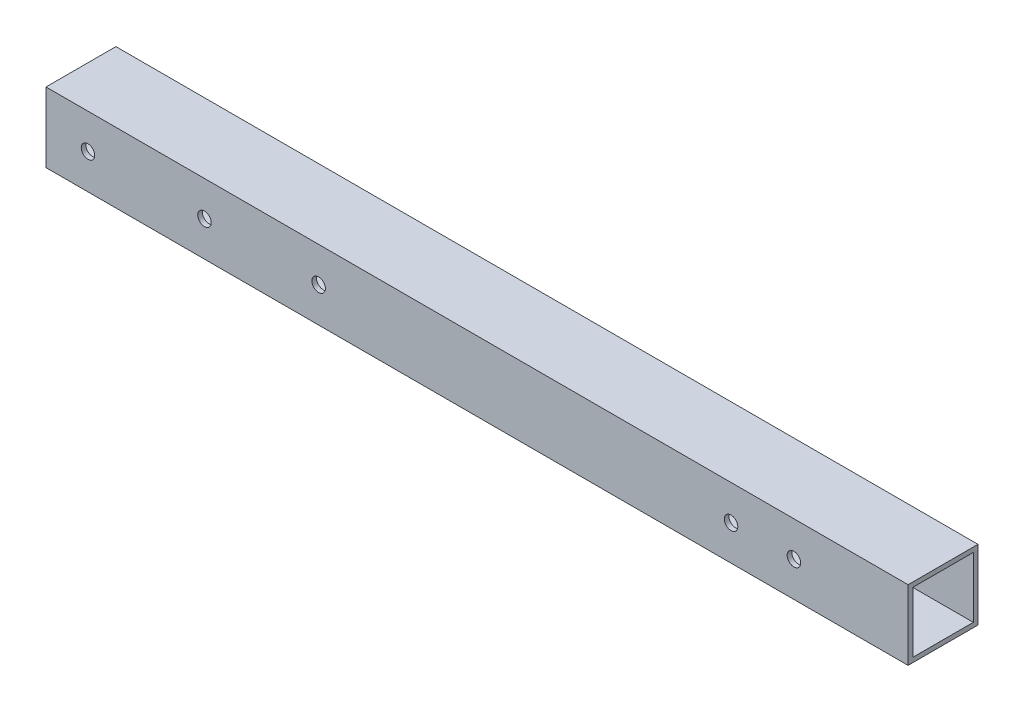
ISO-10303-21;
HEADER;
FILE_DESCRIPTION(('STEP AP214'),'2;1');
FILE_NAME('part.step','',(''),(''),'','','');
FILE_SCHEMA(('AUTOMOTIVE_DESIGN { 1 0 10303 214 1 1 1 1 }'));
ENDSEC;
DATA;
#1=APPLICATION_CONTEXT('core data for automotive mechanical design processes');
#2=APPLICATION_PROTOCOL_DEFINITION('international standard','automotive_design',2000,#1);
#3=PRODUCT_CONTEXT('',#1,'mechanical');
#4=PRODUCT('Part','Part','',(#3));
#5=PRODUCT_RELATED_PRODUCT_CATEGORY('part','',(#4));
#6=PRODUCT_DEFINITION_FORMATION('','',#4);
#7=PRODUCT_DEFINITION_CONTEXT('part definition',#1,'design');
#8=PRODUCT_DEFINITION('design','',#6,#7);
#9=PRODUCT_DEFINITION_SHAPE('','',#8);
#10=(LENGTH_UNIT() NAMED_UNIT(*) SI_UNIT(.MILLI.,.METRE.));
#11=(NAMED_UNIT(*) PLANE_ANGLE_UNIT() SI_UNIT($,.RADIAN.));
#12=(NAMED_UNIT(*) SI_UNIT($,.STERADIAN.) SOLID_ANGLE_UNIT());
#13=UNCERTAINTY_MEASURE_WITH_UNIT(LENGTH_MEASURE(1.E-05),#10,'distance_accuracy_value','');
#14=(GEOMETRIC_REPRESENTATION_CONTEXT(3) GLOBAL_UNCERTAINTY_ASSIGNED_CONTEXT((#13)) GLOBAL_UNIT_ASSIGNED_CONTEXT((#10,
#11,#12)) REPRESENTATION_CONTEXT('',''));
#15=CARTESIAN_POINT('',(0.,0.,0.));
#16=DIRECTION('',(0.,0.,1.));
#17=DIRECTION('',(1.,0.,0.));
#18=AXIS2_PLACEMENT_3D('',#15,#16,#17);
#19=CARTESIAN_POINT('',(185.,0.,0.));
#20=DIRECTION('',(-1.,0.,0.));
#21=DIRECTION('',(0.,0.,1.));
#22=AXIS2_PLACEMENT_3D('',#19,#20,#21);
#23=PLANE('',#22);
#24=DIRECTION('',(0.,1.,0.));
#25=VECTOR('',#24,1.);
#26=CARTESIAN_POINT('',(185.,-7.5,-7.5));
#27=LINE('',#26,#25);
#28=CARTESIAN_POINT('',(185.,-7.5,-7.5));
#29=VERTEX_POINT('',#28);
#30=CARTESIAN_POINT('',(185.,7.5,-7.5));
#31=VERTEX_POINT('',#30);
#32=EDGE_CURVE('E146',#29,#31,#27,.T.);
#33=ORIENTED_EDGE('',*,*,#32,.T.);
#34=DIRECTION('',(0.,0.,1.));
#35=VECTOR('',#34,1.);
#36=CARTESIAN_POINT('',(185.,7.5,7.5));
#37=LINE('',#36,#35);
#38=CARTESIAN_POINT('',(185.,7.5,7.5));
#39=VERTEX_POINT('',#38);
#40=EDGE_CURVE('E149',#31,#39,#37,.T.);
#41=ORIENTED_EDGE('',*,*,#40,.T.);
#42=DIRECTION('',(0.,-1.,0.));
#43=VECTOR('',#42,1.);
#44=CARTESIAN_POINT('',(185.,-7.5,7.5));
#45=LINE('',#44,#43);
#46=CARTESIAN_POINT('',(185.,-7.5,7.5));
#47=VERTEX_POINT('',#46);
#48=EDGE_CURVE('E152',#39,#47,#45,.T.);
#49=ORIENTED_EDGE('',*,*,#48,.T.);
#50=DIRECTION('',(0.,0.,-1.));
#51=VECTOR('',#50,1.);
#52=CARTESIAN_POINT('',(185.,-7.5,7.5));
#53=LINE('',#52,#51);
#54=EDGE_CURVE('E154',#47,#29,#53,.T.);
#55=ORIENTED_EDGE('',*,*,#54,.T.);
#56=EDGE_LOOP('',(#33,#41,#49,#55));
#57=FACE_BOUND('',#56,.T.);
#58=DIRECTION('',(0.,0.,-1.));
#59=VECTOR('',#58,1.);
#60=CARTESIAN_POINT('',(185.,-6.5,6.5));
#61=LINE('',#60,#59);
#62=CARTESIAN_POINT('',(185.,-6.5,6.5));
#63=VERTEX_POINT('',#62);
#64=CARTESIAN_POINT('',(185.,-6.5,-6.5));
#65=VERTEX_POINT('',#64);
#66=EDGE_CURVE('E108',#63,#65,#61,.T.);
#67=ORIENTED_EDGE('',*,*,#66,.F.);
#68=DIRECTION('',(0.,-1.,0.));
#69=VECTOR('',#68,1.);
#70=CARTESIAN_POINT('',(185.,-6.5,6.5));
#71=LINE('',#70,#69);
#72=CARTESIAN_POINT('',(185.,6.5,6.5));
#73=VERTEX_POINT('',#72);
#74=EDGE_CURVE('E130',#73,#63,#71,.T.);
#75=ORIENTED_EDGE('',*,*,#74,.F.);
#76=DIRECTION('',(0.,0.,1.));
#77=VECTOR('',#76,1.);
#78=CARTESIAN_POINT('',(185.,6.5,6.5));
#79=LINE('',#78,#77);
#80=CARTESIAN_POINT('',(185.,6.5,-6.5));
#81=VERTEX_POINT('',#80);
#82=EDGE_CURVE('E128',#81,#73,#79,.T.);
#83=ORIENTED_EDGE('',*,*,#82,.F.);
#84=DIRECTION('',(0.,1.,0.));
#85=VECTOR('',#84,1.);
#86=CARTESIAN_POINT('',(185.,-6.5,-6.5));
#87=LINE('',#86,#85);
#88=EDGE_CURVE('E116',#65,#81,#87,.T.);
#89=ORIENTED_EDGE('',*,*,#88,.F.);
#90=EDGE_LOOP('',(#67,#75,#83,#89));
#91=FACE_BOUND('',#90,.T.);
#92=ADVANCED_FACE('F41',(#57,#91),#23,.F.);
#93=CARTESIAN_POINT('',(0.,0.,0.));
#94=DIRECTION('',(-1.,0.,0.));
#95=DIRECTION('',(0.,0.,1.));
#96=AXIS2_PLACEMENT_3D('',#93,#94,#95);
#97=PLANE('',#96);
#98=DIRECTION('',(0.,1.,0.));
#99=VECTOR('',#98,1.);
#100=CARTESIAN_POINT('',(0.,-7.5,-7.5));
#101=LINE('',#100,#99);
#102=CARTESIAN_POINT('',(0.,-7.5,-7.5));
#103=VERTEX_POINT('',#102);
#104=CARTESIAN_POINT('',(0.,7.5,-7.5));
#105=VERTEX_POINT('',#104);
#106=EDGE_CURVE('E124',#103,#105,#101,.T.);
#107=ORIENTED_EDGE('',*,*,#106,.F.);
#108=DIRECTION('',(0.,0.,-1.));
#109=VECTOR('',#108,1.);
#110=CARTESIAN_POINT('',(0.,-7.5,7.5));
#111=LINE('',#110,#109);
#112=CARTESIAN_POINT('',(0.,-7.5,7.5));
#113=VERTEX_POINT('',#112);
#114=EDGE_CURVE('E150',#113,#103,#111,.T.);
#115=ORIENTED_EDGE('',*,*,#114,.F.);
#116=DIRECTION('',(0.,-1.,0.));
#117=VECTOR('',#116,1.);
#118=CARTESIAN_POINT('',(0.,-7.5,7.5));
#119=LINE('',#118,#117);
#120=CARTESIAN_POINT('',(0.,7.5,7.5));
#121=VERTEX_POINT('',#120);
#122=EDGE_CURVE('E161',#121,#113,#119,.T.);
#123=ORIENTED_EDGE('',*,*,#122,.F.);
#124=DIRECTION('',(0.,0.,1.));
#125=VECTOR('',#124,1.);
#126=CARTESIAN_POINT('',(0.,7.5,7.5));
#127=LINE('',#126,#125);
#128=EDGE_CURVE('E159',#105,#121,#127,.T.);
#129=ORIENTED_EDGE('',*,*,#128,.F.);
#130=EDGE_LOOP('',(#107,#115,#123,#129));
#131=FACE_BOUND('',#130,.T.);
#132=DIRECTION('',(0.,-1.,0.));
#133=VECTOR('',#132,1.);
#134=CARTESIAN_POINT('',(0.,-6.5,6.5));
#135=LINE('',#134,#133);
#136=CARTESIAN_POINT('',(0.,6.5,6.5));
#137=VERTEX_POINT('',#136);
#138=CARTESIAN_POINT('',(0.,-6.5,6.5));
#139=VERTEX_POINT('',#138);
#140=EDGE_CURVE('E117',#137,#139,#135,.T.);
#141=ORIENTED_EDGE('',*,*,#140,.T.);
#142=DIRECTION('',(0.,0.,-1.));
#143=VECTOR('',#142,1.);
#144=CARTESIAN_POINT('',(0.,-6.5,6.5));
#145=LINE('',#144,#143);
#146=CARTESIAN_POINT('',(0.,-6.5,-6.5));
#147=VERTEX_POINT('',#146);
#148=EDGE_CURVE('E66',#139,#147,#145,.T.);
#149=ORIENTED_EDGE('',*,*,#148,.T.);
#150=DIRECTION('',(0.,1.,0.));
#151=VECTOR('',#150,1.);
#152=CARTESIAN_POINT('',(0.,-6.5,-6.5));
#153=LINE('',#152,#151);
#154=CARTESIAN_POINT('',(0.,6.5,-6.5));
#155=VERTEX_POINT('',#154);
#156=EDGE_CURVE('E123',#147,#155,#153,.T.);
#157=ORIENTED_EDGE('',*,*,#156,.T.);
#158=DIRECTION('',(0.,0.,1.));
#159=VECTOR('',#158,1.);
#160=CARTESIAN_POINT('',(0.,6.5,6.5));
#161=LINE('',#160,#159);
#162=EDGE_CURVE('E138',#155,#137,#161,.T.);
#163=ORIENTED_EDGE('',*,*,#162,.T.);
#164=EDGE_LOOP('',(#141,#149,#157,#163));
#165=FACE_BOUND('',#164,.T.);
#166=ADVANCED_FACE('F219',(#131,#165),#97,.T.);
#167=CARTESIAN_POINT('',(185.,-7.5,-7.5));
#168=DIRECTION('',(0.,0.,1.));
#169=DIRECTION('',(1.,0.,0.));
#170=AXIS2_PLACEMENT_3D('',#167,#168,#169);
#171=PLANE('',#170);
#172=CARTESIAN_POINT('',(9.01039609334854,0.,-7.5));
#173=DIRECTION('',(0.,0.,-1.));
#174=DIRECTION('',(-1.,0.,0.));
#175=AXIS2_PLACEMENT_3D('',#172,#173,#174);
#176=CIRCLE('',#175,1.45);
#177=CARTESIAN_POINT('',(7.56039609334854,0.,-7.5));
#178=VERTEX_POINT('',#177);
#179=EDGE_CURVE('E270',#178,#178,#176,.T.);
#180=ORIENTED_EDGE('',*,*,#179,.F.);
#181=EDGE_LOOP('',(#180));
#182=FACE_BOUND('',#181,.T.);
#183=CARTESIAN_POINT('',(160.5,-1.05818132034585E-13,-7.5));
#184=DIRECTION('',(0.,0.,-1.));
#185=DIRECTION('',(-1.,0.,0.));
#186=AXIS2_PLACEMENT_3D('',#183,#184,#185);
#187=CIRCLE('',#186,1.45);
#188=CARTESIAN_POINT('',(159.05,-1.05818132034585E-13,-7.5));
#189=VERTEX_POINT('',#188);
#190=EDGE_CURVE('E274',#189,#189,#187,.T.);
#191=ORIENTED_EDGE('',*,*,#190,.F.);
#192=EDGE_LOOP('',(#191));
#193=FACE_BOUND('',#192,.T.);
#194=CARTESIAN_POINT('',(147.,-1.04950770296597E-13,-7.5));
#195=DIRECTION('',(0.,0.,-1.));
#196=DIRECTION('',(-1.,0.,0.));
#197=AXIS2_PLACEMENT_3D('',#194,#195,#196);
#198=CIRCLE('',#197,1.45);
#199=CARTESIAN_POINT('',(145.55,-1.04950770296597E-13,-7.5));
#200=VERTEX_POINT('',#199);
#201=EDGE_CURVE('E278',#200,#200,#198,.T.);
#202=ORIENTED_EDGE('',*,*,#201,.F.);
#203=EDGE_LOOP('',(#202));
#204=FACE_BOUND('',#203,.T.);
#205=CARTESIAN_POINT('',(58.5000000000001,0.,-7.5));
#206=DIRECTION('',(0.,0.,-1.));
#207=DIRECTION('',(-1.,0.,0.));
#208=AXIS2_PLACEMENT_3D('',#205,#206,#207);
#209=CIRCLE('',#208,1.45000000000001);
#210=CARTESIAN_POINT('',(57.0500000000001,0.,-7.5));
#211=VERTEX_POINT('',#210);
#212=EDGE_CURVE('E282',#211,#211,#209,.T.);
#213=ORIENTED_EDGE('',*,*,#212,.F.);
#214=EDGE_LOOP('',(#213));
#215=FACE_BOUND('',#214,.T.);
#216=CARTESIAN_POINT('',(34.0103960933485,0.,-7.5));
#217=DIRECTION('',(0.,0.,-1.));
#218=DIRECTION('',(-1.,0.,0.));
#219=AXIS2_PLACEMENT_3D('',#216,#217,#218);
#220=CIRCLE('',#219,1.45);
#221=CARTESIAN_POINT('',(32.5603960933486,0.,-7.5));
#222=VERTEX_POINT('',#221);
#223=EDGE_CURVE('E285',#222,#222,#220,.T.);
#224=ORIENTED_EDGE('',*,*,#223,.F.);
#225=EDGE_LOOP('',(#224));
#226=FACE_BOUND('',#225,.T.);
#227=ORIENTED_EDGE('',*,*,#106,.T.);
#228=DIRECTION('',(-1.,0.,0.));
#229=VECTOR('',#228,1.);
#230=CARTESIAN_POINT('',(185.,7.5,-7.5));
#231=LINE('',#230,#229);
#232=EDGE_CURVE('E11',#31,#105,#231,.T.);
#233=ORIENTED_EDGE('',*,*,#232,.F.);
#234=ORIENTED_EDGE('',*,*,#32,.F.);
#235=DIRECTION('',(-1.,0.,0.));
#236=VECTOR('',#235,1.);
#237=CARTESIAN_POINT('',(185.,-7.5,-7.5));
#238=LINE('',#237,#236);
#239=EDGE_CURVE('E156',#29,#103,#238,.T.);
#240=ORIENTED_EDGE('',*,*,#239,.T.);
#241=EDGE_LOOP('',(#227,#233,#234,#240));
#242=FACE_BOUND('',#241,.T.);
#243=ADVANCED_FACE('F43',(#182,#193,#204,#215,#226,#242),#171,.F.);
#244=CARTESIAN_POINT('',(185.,7.5,7.5));
#245=DIRECTION('',(0.,-1.,0.));
#246=DIRECTION('',(0.,0.,-1.));
#247=AXIS2_PLACEMENT_3D('',#244,#245,#246);
#248=PLANE('',#247);
#249=ORIENTED_EDGE('',*,*,#128,.T.);
#250=DIRECTION('',(-1.,0.,0.));
#251=VECTOR('',#250,1.);
#252=CARTESIAN_POINT('',(185.,7.5,7.5));
#253=LINE('',#252,#251);
#254=EDGE_CURVE('E50',#39,#121,#253,.T.);
#255=ORIENTED_EDGE('',*,*,#254,.F.);
#256=ORIENTED_EDGE('',*,*,#40,.F.);
#257=ORIENTED_EDGE('',*,*,#232,.T.);
#258=EDGE_LOOP('',(#249,#255,#256,#257));
#259=FACE_BOUND('',#258,.T.);
#260=ADVANCED_FACE('F246',(#259),#248,.F.);
#261=CARTESIAN_POINT('',(185.,-7.5,7.5));
#262=DIRECTION('',(0.,0.,-1.));
#263=DIRECTION('',(-1.,0.,0.));
#264=AXIS2_PLACEMENT_3D('',#261,#262,#263);
#265=PLANE('',#264);
#266=CARTESIAN_POINT('',(9.01039609334854,0.,7.5));
#267=DIRECTION('',(0.,0.,-1.));
#268=DIRECTION('',(-1.,0.,0.));
#269=AXIS2_PLACEMENT_3D('',#266,#267,#268);
#270=CIRCLE('',#269,1.45);
#271=CARTESIAN_POINT('',(7.56039609334854,0.,7.5));
#272=VERTEX_POINT('',#271);
#273=EDGE_CURVE('E175',#272,#272,#270,.T.);
#274=ORIENTED_EDGE('',*,*,#273,.T.);
#275=EDGE_LOOP('',(#274));
#276=FACE_BOUND('',#275,.T.);
#277=CARTESIAN_POINT('',(160.5,-1.05818132034585E-13,7.5));
#278=DIRECTION('',(0.,0.,-1.));
#279=DIRECTION('',(-1.,0.,0.));
#280=AXIS2_PLACEMENT_3D('',#277,#278,#279);
#281=CIRCLE('',#280,1.45);
#282=CARTESIAN_POINT('',(159.05,-1.05818132034585E-13,7.5));
#283=VERTEX_POINT('',#282);
#284=EDGE_CURVE('E344',#283,#283,#281,.T.);
#285=ORIENTED_EDGE('',*,*,#284,.T.);
#286=EDGE_LOOP('',(#285));
#287=FACE_BOUND('',#286,.T.);
#288=CARTESIAN_POINT('',(147.,-1.04950770296597E-13,7.5));
#289=DIRECTION('',(0.,0.,-1.));
#290=DIRECTION('',(-1.,0.,0.));
#291=AXIS2_PLACEMENT_3D('',#288,#289,#290);
#292=CIRCLE('',#291,1.45);
#293=CARTESIAN_POINT('',(145.55,-1.04950770296597E-13,7.5));
#294=VERTEX_POINT('',#293);
#295=EDGE_CURVE('E352',#294,#294,#292,.T.);
#296=ORIENTED_EDGE('',*,*,#295,.T.);
#297=EDGE_LOOP('',(#296));
#298=FACE_BOUND('',#297,.T.);
#299=CARTESIAN_POINT('',(58.5000000000001,0.,7.5));
#300=DIRECTION('',(0.,0.,-1.));
#301=DIRECTION('',(-1.,0.,0.));
#302=AXIS2_PLACEMENT_3D('',#299,#300,#301);
#303=CIRCLE('',#302,1.45000000000001);
#304=CARTESIAN_POINT('',(57.0500000000001,0.,7.5));
#305=VERTEX_POINT('',#304);
#306=EDGE_CURVE('E287',#305,#305,#303,.T.);
#307=ORIENTED_EDGE('',*,*,#306,.T.);
#308=EDGE_LOOP('',(#307));
#309=FACE_BOUND('',#308,.T.);
#310=CARTESIAN_POINT('',(34.0103960933485,0.,7.5));
#311=DIRECTION('',(0.,0.,-1.));
#312=DIRECTION('',(-1.,0.,0.));
#313=AXIS2_PLACEMENT_3D('',#310,#311,#312);
#314=CIRCLE('',#313,1.45);
#315=CARTESIAN_POINT('',(32.5603960933486,0.,7.5));
#316=VERTEX_POINT('',#315);
#317=EDGE_CURVE('E288',#316,#316,#314,.T.);
#318=ORIENTED_EDGE('',*,*,#317,.T.);
#319=EDGE_LOOP('',(#318));
#320=FACE_BOUND('',#319,.T.);
#321=ORIENTED_EDGE('',*,*,#122,.T.);
#322=DIRECTION('',(-1.,0.,0.));
#323=VECTOR('',#322,1.);
#324=CARTESIAN_POINT('',(185.,-7.5,7.5));
#325=LINE('',#324,#323);
#326=EDGE_CURVE('E166',#47,#113,#325,.T.);
#327=ORIENTED_EDGE('',*,*,#326,.F.);
#328=ORIENTED_EDGE('',*,*,#48,.F.);
#329=ORIENTED_EDGE('',*,*,#254,.T.);
#330=EDGE_LOOP('',(#321,#327,#328,#329));
#331=FACE_BOUND('',#330,.T.);
#332=ADVANCED_FACE('F243',(#276,#287,#298,#309,#320,#331),#265,.F.);
#333=CARTESIAN_POINT('',(185.,-7.5,7.5));
#334=DIRECTION('',(0.,1.,0.));
#335=DIRECTION('',(0.,0.,1.));
#336=AXIS2_PLACEMENT_3D('',#333,#334,#335);
#337=PLANE('',#336);
#338=ORIENTED_EDGE('',*,*,#114,.T.);
#339=ORIENTED_EDGE('',*,*,#239,.F.);
#340=ORIENTED_EDGE('',*,*,#54,.F.);
#341=ORIENTED_EDGE('',*,*,#326,.T.);
#342=EDGE_LOOP('',(#338,#339,#340,#341));
#343=FACE_BOUND('',#342,.T.);
#344=ADVANCED_FACE('F240',(#343),#337,.F.);
#345=CARTESIAN_POINT('',(185.,-6.5,6.5));
#346=DIRECTION('',(0.,1.,0.));
#347=DIRECTION('',(0.,0.,1.));
#348=AXIS2_PLACEMENT_3D('',#345,#346,#347);
#349=PLANE('',#348);
#350=ORIENTED_EDGE('',*,*,#148,.F.);
#351=DIRECTION('',(-1.,0.,0.));
#352=VECTOR('',#351,1.);
#353=CARTESIAN_POINT('',(185.,-6.5,6.5));
#354=LINE('',#353,#352);
#355=EDGE_CURVE('E112',#63,#139,#354,.T.);
#356=ORIENTED_EDGE('',*,*,#355,.F.);
#357=ORIENTED_EDGE('',*,*,#66,.T.);
#358=DIRECTION('',(-1.,0.,0.));
#359=VECTOR('',#358,1.);
#360=CARTESIAN_POINT('',(185.,-6.5,-6.5));
#361=LINE('',#360,#359);
#362=EDGE_CURVE('E111',#65,#147,#361,.T.);
#363=ORIENTED_EDGE('',*,*,#362,.T.);
#364=EDGE_LOOP('',(#350,#356,#357,#363));
#365=FACE_BOUND('',#364,.T.);
#366=ADVANCED_FACE('F110',(#365),#349,.T.);
#367=CARTESIAN_POINT('',(185.,-6.5,-6.5));
#368=DIRECTION('',(0.,0.,1.));
#369=DIRECTION('',(0.,-1.,0.));
#370=AXIS2_PLACEMENT_3D('',#367,#368,#369);
#371=PLANE('',#370);
#372=CARTESIAN_POINT('',(9.01039609334854,0.,-6.5));
#373=DIRECTION('',(0.,0.,1.));
#374=DIRECTION('',(0.,-1.,0.));
#375=AXIS2_PLACEMENT_3D('',#372,#373,#374);
#376=CIRCLE('',#375,1.45);
#377=CARTESIAN_POINT('',(9.01039609334854,-1.45,-6.5));
#378=VERTEX_POINT('',#377);
#379=EDGE_CURVE('E136',#378,#378,#376,.T.);
#380=ORIENTED_EDGE('',*,*,#379,.F.);
#381=EDGE_LOOP('',(#380));
#382=FACE_BOUND('',#381,.T.);
#383=CARTESIAN_POINT('',(160.5,-1.05818132034585E-13,-6.5));
#384=DIRECTION('',(0.,0.,1.));
#385=DIRECTION('',(0.,-1.,0.));
#386=AXIS2_PLACEMENT_3D('',#383,#384,#385);
#387=CIRCLE('',#386,1.45);
#388=CARTESIAN_POINT('',(160.5,-1.45000000000011,-6.5));
#389=VERTEX_POINT('',#388);
#390=EDGE_CURVE('E185',#389,#389,#387,.T.);
#391=ORIENTED_EDGE('',*,*,#390,.F.);
#392=EDGE_LOOP('',(#391));
#393=FACE_BOUND('',#392,.T.);
#394=CARTESIAN_POINT('',(147.,-1.04950770296597E-13,-6.5));
#395=DIRECTION('',(0.,0.,1.));
#396=DIRECTION('',(0.,-1.,0.));
#397=AXIS2_PLACEMENT_3D('',#394,#395,#396);
#398=CIRCLE('',#397,1.45);
#399=CARTESIAN_POINT('',(147.,-1.4500000000001,-6.5));
#400=VERTEX_POINT('',#399);
#401=EDGE_CURVE('E182',#400,#400,#398,.T.);
#402=ORIENTED_EDGE('',*,*,#401,.F.);
#403=EDGE_LOOP('',(#402));
#404=FACE_BOUND('',#403,.T.);
#405=CARTESIAN_POINT('',(58.5000000000001,0.,-6.5));
#406=DIRECTION('',(0.,0.,1.));
#407=DIRECTION('',(0.,-1.,0.));
#408=AXIS2_PLACEMENT_3D('',#405,#406,#407);
#409=CIRCLE('',#408,1.45000000000001);
#410=CARTESIAN_POINT('',(58.5000000000001,-1.45000000000006,-6.5));
#411=VERTEX_POINT('',#410);
#412=EDGE_CURVE('E179',#411,#411,#409,.T.);
#413=ORIENTED_EDGE('',*,*,#412,.F.);
#414=EDGE_LOOP('',(#413));
#415=FACE_BOUND('',#414,.T.);
#416=CARTESIAN_POINT('',(34.0103960933485,0.,-6.5));
#417=DIRECTION('',(0.,0.,1.));
#418=DIRECTION('',(0.,-1.,0.));
#419=AXIS2_PLACEMENT_3D('',#416,#417,#418);
#420=CIRCLE('',#419,1.45);
#421=CARTESIAN_POINT('',(34.0103960933485,-1.45000000000001,-6.5));
#422=VERTEX_POINT('',#421);
#423=EDGE_CURVE('E174',#422,#422,#420,.T.);
#424=ORIENTED_EDGE('',*,*,#423,.F.);
#425=EDGE_LOOP('',(#424));
#426=FACE_BOUND('',#425,.T.);
#427=ORIENTED_EDGE('',*,*,#156,.F.);
#428=ORIENTED_EDGE('',*,*,#362,.F.);
#429=ORIENTED_EDGE('',*,*,#88,.T.);
#430=DIRECTION('',(-1.,0.,0.));
#431=VECTOR('',#430,1.);
#432=CARTESIAN_POINT('',(185.,6.5,-6.5));
#433=LINE('',#432,#431);
#434=EDGE_CURVE('E125',#81,#155,#433,.T.);
#435=ORIENTED_EDGE('',*,*,#434,.T.);
#436=EDGE_LOOP('',(#427,#428,#429,#435));
#437=FACE_BOUND('',#436,.T.);
#438=ADVANCED_FACE('F120',(#382,#393,#404,#415,#426,#437),#371,.T.);
#439=CARTESIAN_POINT('',(185.,6.5,6.5));
#440=DIRECTION('',(0.,-1.,0.));
#441=DIRECTION('',(0.,0.,-1.));
#442=AXIS2_PLACEMENT_3D('',#439,#440,#441);
#443=PLANE('',#442);
#444=ORIENTED_EDGE('',*,*,#162,.F.);
#445=ORIENTED_EDGE('',*,*,#434,.F.);
#446=ORIENTED_EDGE('',*,*,#82,.T.);
#447=DIRECTION('',(-1.,0.,0.));
#448=VECTOR('',#447,1.);
#449=CARTESIAN_POINT('',(185.,6.5,6.5));
#450=LINE('',#449,#448);
#451=EDGE_CURVE('E58',#73,#137,#450,.T.);
#452=ORIENTED_EDGE('',*,*,#451,.T.);
#453=EDGE_LOOP('',(#444,#445,#446,#452));
#454=FACE_BOUND('',#453,.T.);
#455=ADVANCED_FACE('F209',(#454),#443,.T.);
#456=CARTESIAN_POINT('',(185.,-6.5,6.5));
#457=DIRECTION('',(0.,0.,-1.));
#458=DIRECTION('',(-1.,0.,0.));
#459=AXIS2_PLACEMENT_3D('',#456,#457,#458);
#460=PLANE('',#459);
#461=CARTESIAN_POINT('',(9.01039609334854,0.,6.5));
#462=DIRECTION('',(0.,0.,-1.));
#463=DIRECTION('',(-1.,0.,0.));
#464=AXIS2_PLACEMENT_3D('',#461,#462,#463);
#465=CIRCLE('',#464,1.45);
#466=CARTESIAN_POINT('',(7.56039609334854,0.,6.5));
#467=VERTEX_POINT('',#466);
#468=EDGE_CURVE('E45',#467,#467,#465,.T.);
#469=ORIENTED_EDGE('',*,*,#468,.F.);
#470=EDGE_LOOP('',(#469));
#471=FACE_BOUND('',#470,.T.);
#472=CARTESIAN_POINT('',(160.5,-1.05818132034585E-13,6.5));
#473=DIRECTION('',(0.,0.,-1.));
#474=DIRECTION('',(-1.,0.,0.));
#475=AXIS2_PLACEMENT_3D('',#472,#473,#474);
#476=CIRCLE('',#475,1.45);
#477=CARTESIAN_POINT('',(159.05,-1.05818132034585E-13,6.5));
#478=VERTEX_POINT('',#477);
#479=EDGE_CURVE('E183',#478,#478,#476,.T.);
#480=ORIENTED_EDGE('',*,*,#479,.F.);
#481=EDGE_LOOP('',(#480));
#482=FACE_BOUND('',#481,.T.);
#483=CARTESIAN_POINT('',(147.,-1.04950770296597E-13,6.5));
#484=DIRECTION('',(0.,0.,-1.));
#485=DIRECTION('',(-1.,0.,0.));
#486=AXIS2_PLACEMENT_3D('',#483,#484,#485);
#487=CIRCLE('',#486,1.45);
#488=CARTESIAN_POINT('',(145.55,-1.04950770296597E-13,6.5));
#489=VERTEX_POINT('',#488);
#490=EDGE_CURVE('E180',#489,#489,#487,.T.);
#491=ORIENTED_EDGE('',*,*,#490,.F.);
#492=EDGE_LOOP('',(#491));
#493=FACE_BOUND('',#492,.T.);
#494=CARTESIAN_POINT('',(58.5000000000001,0.,6.5));
#495=DIRECTION('',(0.,0.,-1.));
#496=DIRECTION('',(-1.,0.,0.));
#497=AXIS2_PLACEMENT_3D('',#494,#495,#496);
#498=CIRCLE('',#497,1.45000000000001);
#499=CARTESIAN_POINT('',(57.0500000000001,0.,6.5));
#500=VERTEX_POINT('',#499);
#501=EDGE_CURVE('E176',#500,#500,#498,.T.);
#502=ORIENTED_EDGE('',*,*,#501,.F.);
#503=EDGE_LOOP('',(#502));
#504=FACE_BOUND('',#503,.T.);
#505=CARTESIAN_POINT('',(34.0103960933485,0.,6.5));
#506=DIRECTION('',(0.,0.,-1.));
#507=DIRECTION('',(-1.,0.,0.));
#508=AXIS2_PLACEMENT_3D('',#505,#506,#507);
#509=CIRCLE('',#508,1.45);
#510=CARTESIAN_POINT('',(32.5603960933486,0.,6.5));
#511=VERTEX_POINT('',#510);
#512=EDGE_CURVE('E171',#511,#511,#509,.T.);
#513=ORIENTED_EDGE('',*,*,#512,.F.);
#514=EDGE_LOOP('',(#513));
#515=FACE_BOUND('',#514,.T.);
#516=ORIENTED_EDGE('',*,*,#140,.F.);
#517=ORIENTED_EDGE('',*,*,#451,.F.);
#518=ORIENTED_EDGE('',*,*,#74,.T.);
#519=ORIENTED_EDGE('',*,*,#355,.T.);
#520=EDGE_LOOP('',(#516,#517,#518,#519));
#521=FACE_BOUND('',#520,.T.);
#522=ADVANCED_FACE('F205',(#471,#482,#493,#504,#515,#521),#460,.T.);
#523=CARTESIAN_POINT('',(34.0103960933485,0.,7.5));
#524=DIRECTION('',(0.,0.,-1.));
#525=DIRECTION('',(-1.,0.,0.));
#526=AXIS2_PLACEMENT_3D('',#523,#524,#525);
#527=CYLINDRICAL_SURFACE('',#526,1.45);
#528=ORIENTED_EDGE('',*,*,#512,.T.);
#529=EDGE_LOOP('',(#528));
#530=FACE_BOUND('',#529,.T.);
#531=ORIENTED_EDGE('',*,*,#317,.F.);
#532=EDGE_LOOP('',(#531));
#533=FACE_BOUND('',#532,.T.);
#534=ADVANCED_FACE('F208',(#530,#533),#527,.F.);
#535=CARTESIAN_POINT('',(58.5000000000001,0.,7.5));
#536=DIRECTION('',(0.,0.,-1.));
#537=DIRECTION('',(-1.,0.,0.));
#538=AXIS2_PLACEMENT_3D('',#535,#536,#537);
#539=CYLINDRICAL_SURFACE('',#538,1.45000000000001);
#540=ORIENTED_EDGE('',*,*,#501,.T.);
#541=EDGE_LOOP('',(#540));
#542=FACE_BOUND('',#541,.T.);
#543=ORIENTED_EDGE('',*,*,#306,.F.);
#544=EDGE_LOOP('',(#543));
#545=FACE_BOUND('',#544,.T.);
#546=ADVANCED_FACE('F310',(#542,#545),#539,.F.);
#547=CARTESIAN_POINT('',(147.,-1.04950770296597E-13,7.5));
#548=DIRECTION('',(0.,0.,-1.));
#549=DIRECTION('',(-1.,0.,0.));
#550=AXIS2_PLACEMENT_3D('',#547,#548,#549);
#551=CYLINDRICAL_SURFACE('',#550,1.45);
#552=ORIENTED_EDGE('',*,*,#490,.T.);
#553=EDGE_LOOP('',(#552));
#554=FACE_BOUND('',#553,.T.);
#555=ORIENTED_EDGE('',*,*,#295,.F.);
#556=EDGE_LOOP('',(#555));
#557=FACE_BOUND('',#556,.T.);
#558=ADVANCED_FACE('F319',(#554,#557),#551,.F.);
#559=CARTESIAN_POINT('',(160.5,-1.05818132034585E-13,7.5));
#560=DIRECTION('',(0.,0.,-1.));
#561=DIRECTION('',(-1.,0.,0.));
#562=AXIS2_PLACEMENT_3D('',#559,#560,#561);
#563=CYLINDRICAL_SURFACE('',#562,1.45);
#564=ORIENTED_EDGE('',*,*,#479,.T.);
#565=EDGE_LOOP('',(#564));
#566=FACE_BOUND('',#565,.T.);
#567=ORIENTED_EDGE('',*,*,#284,.F.);
#568=EDGE_LOOP('',(#567));
#569=FACE_BOUND('',#568,.T.);
#570=ADVANCED_FACE('F311',(#566,#569),#563,.F.);
#571=CARTESIAN_POINT('',(9.01039609334854,0.,7.5));
#572=DIRECTION('',(0.,0.,-1.));
#573=DIRECTION('',(-1.,0.,0.));
#574=AXIS2_PLACEMENT_3D('',#571,#572,#573);
#575=CYLINDRICAL_SURFACE('',#574,1.45);
#576=ORIENTED_EDGE('',*,*,#468,.T.);
#577=EDGE_LOOP('',(#576));
#578=FACE_BOUND('',#577,.T.);
#579=ORIENTED_EDGE('',*,*,#273,.F.);
#580=EDGE_LOOP('',(#579));
#581=FACE_BOUND('',#580,.T.);
#582=ADVANCED_FACE('F202',(#578,#581),#575,.F.);
#583=ORIENTED_EDGE('',*,*,#423,.T.);
#584=EDGE_LOOP('',(#583));
#585=FACE_BOUND('',#584,.T.);
#586=ORIENTED_EDGE('',*,*,#223,.T.);
#587=EDGE_LOOP('',(#586));
#588=FACE_BOUND('',#587,.T.);
#589=ADVANCED_FACE('F298',(#585,#588),#527,.F.);
#590=ORIENTED_EDGE('',*,*,#412,.T.);
#591=EDGE_LOOP('',(#590));
#592=FACE_BOUND('',#591,.T.);
#593=ORIENTED_EDGE('',*,*,#212,.T.);
#594=EDGE_LOOP('',(#593));
#595=FACE_BOUND('',#594,.T.);
#596=ADVANCED_FACE('F301',(#592,#595),#539,.F.);
#597=ORIENTED_EDGE('',*,*,#401,.T.);
#598=EDGE_LOOP('',(#597));
#599=FACE_BOUND('',#598,.T.);
#600=ORIENTED_EDGE('',*,*,#201,.T.);
#601=EDGE_LOOP('',(#600));
#602=FACE_BOUND('',#601,.T.);
#603=ADVANCED_FACE('F307',(#599,#602),#551,.F.);
#604=ORIENTED_EDGE('',*,*,#390,.T.);
#605=EDGE_LOOP('',(#604));
#606=FACE_BOUND('',#605,.T.);
#607=ORIENTED_EDGE('',*,*,#190,.T.);
#608=EDGE_LOOP('',(#607));
#609=FACE_BOUND('',#608,.T.);
#610=ADVANCED_FACE('F332',(#606,#609),#563,.F.);
#611=ORIENTED_EDGE('',*,*,#379,.T.);
#612=EDGE_LOOP('',(#611));
#613=FACE_BOUND('',#612,.T.);
#614=ORIENTED_EDGE('',*,*,#179,.T.);
#615=EDGE_LOOP('',(#614));
#616=FACE_BOUND('',#615,.T.);
#617=ADVANCED_FACE('F313',(#613,#616),#575,.F.);
#618=CLOSED_SHELL('',(#92,#166,#243,#260,#332,#344,#366,#438,#455,#522,#534,#546,#558,#570,#582,
#589,#596,#603,#610,#617));
#619=MANIFOLD_SOLID_BREP('B2',#618);
#620=ADVANCED_BREP_SHAPE_REPRESENTATION('',(#18,#619),#14);
#621=SHAPE_DEFINITION_REPRESENTATION(#9,#620);
ENDSEC;
END-ISO-10303-21;
